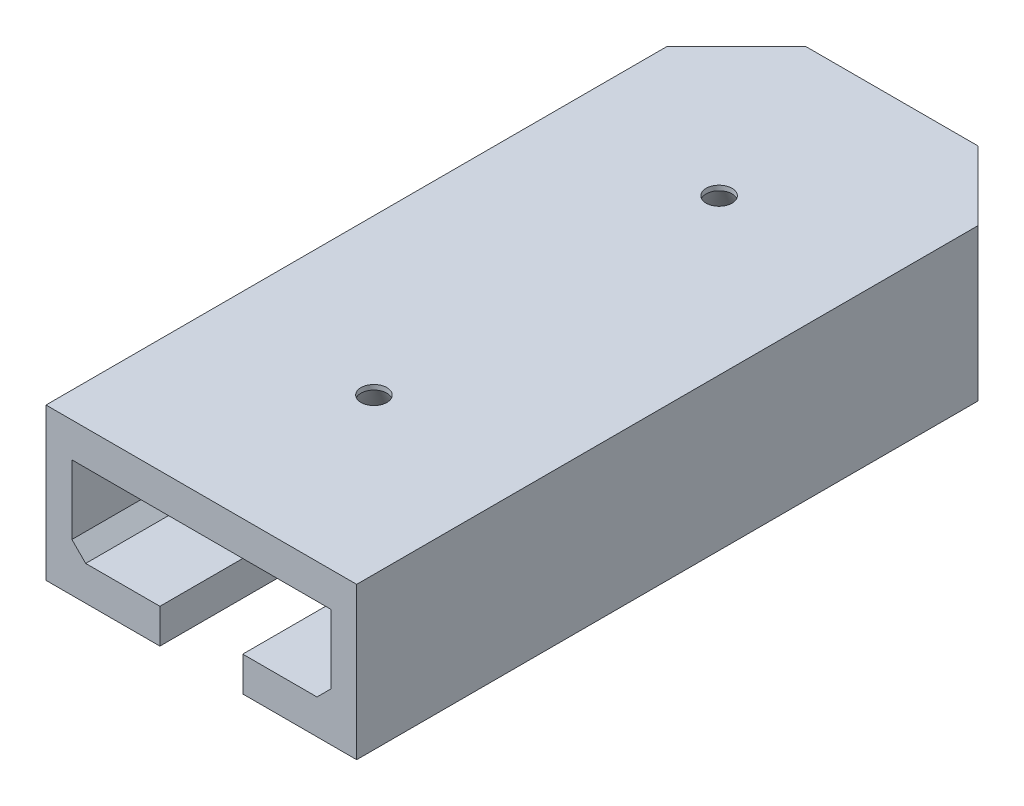
ISO-10303-21;
HEADER;
FILE_DESCRIPTION(('STEP AP214'),'2;1');
FILE_NAME('part.step','',(''),(''),'','','');
FILE_SCHEMA(('AUTOMOTIVE_DESIGN { 1 0 10303 214 1 1 1 1 }'));
ENDSEC;
DATA;
#1=APPLICATION_CONTEXT('core data for automotive mechanical design processes');
#2=APPLICATION_PROTOCOL_DEFINITION('international standard','automotive_design',2000,#1);
#3=PRODUCT_CONTEXT('',#1,'mechanical');
#4=PRODUCT('Part','Part','',(#3));
#5=PRODUCT_RELATED_PRODUCT_CATEGORY('part','',(#4));
#6=PRODUCT_DEFINITION_FORMATION('','',#4);
#7=PRODUCT_DEFINITION_CONTEXT('part definition',#1,'design');
#8=PRODUCT_DEFINITION('design','',#6,#7);
#9=PRODUCT_DEFINITION_SHAPE('','',#8);
#10=(LENGTH_UNIT() NAMED_UNIT(*) SI_UNIT(.MILLI.,.METRE.));
#11=(NAMED_UNIT(*) PLANE_ANGLE_UNIT() SI_UNIT($,.RADIAN.));
#12=(NAMED_UNIT(*) SI_UNIT($,.STERADIAN.) SOLID_ANGLE_UNIT());
#13=UNCERTAINTY_MEASURE_WITH_UNIT(LENGTH_MEASURE(1.E-05),#10,'distance_accuracy_value','');
#14=(GEOMETRIC_REPRESENTATION_CONTEXT(3) GLOBAL_UNCERTAINTY_ASSIGNED_CONTEXT((#13)) GLOBAL_UNIT_ASSIGNED_CONTEXT((#10,
#11,#12)) REPRESENTATION_CONTEXT('',''));
#15=CARTESIAN_POINT('',(0.,0.,0.));
#16=DIRECTION('',(0.,0.,1.));
#17=DIRECTION('',(1.,0.,0.));
#18=AXIS2_PLACEMENT_3D('',#15,#16,#17);
#19=CARTESIAN_POINT('',(0.,0.,0.));
#20=DIRECTION('',(0.,1.,0.));
#21=DIRECTION('',(0.,0.,1.));
#22=AXIS2_PLACEMENT_3D('',#19,#20,#21);
#23=PLANE('',#22);
#24=CARTESIAN_POINT('',(0.,0.,-25.));
#25=DIRECTION('',(0.,-1.,0.));
#26=DIRECTION('',(0.,0.,-1.));
#27=AXIS2_PLACEMENT_3D('',#24,#25,#26);
#28=CIRCLE('',#27,4.5);
#29=CARTESIAN_POINT('',(0.,0.,-29.5));
#30=VERTEX_POINT('',#29);
#31=EDGE_CURVE('E231',#30,#30,#28,.T.);
#32=ORIENTED_EDGE('',*,*,#31,.F.);
#33=EDGE_LOOP('',(#32));
#34=FACE_BOUND('',#33,.T.);
#35=CARTESIAN_POINT('',(0.,0.,25.));
#36=DIRECTION('',(0.,1.,0.));
#37=DIRECTION('',(0.,0.,1.));
#38=AXIS2_PLACEMENT_3D('',#35,#36,#37);
#39=CIRCLE('',#38,4.5);
#40=CARTESIAN_POINT('',(0.,0.,29.5));
#41=VERTEX_POINT('',#40);
#42=EDGE_CURVE('E237',#41,#41,#39,.T.);
#43=ORIENTED_EDGE('',*,*,#42,.T.);
#44=EDGE_LOOP('',(#43));
#45=FACE_BOUND('',#44,.T.);
#46=DIRECTION('',(0.,0.,1.));
#47=VECTOR('',#46,1.);
#48=CARTESIAN_POINT('',(-18.75,0.,50.));
#49=LINE('',#48,#47);
#50=CARTESIAN_POINT('',(-18.75,0.,-40.));
#51=VERTEX_POINT('',#50);
#52=CARTESIAN_POINT('',(-18.75,0.,50.));
#53=VERTEX_POINT('',#52);
#54=EDGE_CURVE('E255',#51,#53,#49,.T.);
#55=ORIENTED_EDGE('',*,*,#54,.F.);
#56=DIRECTION('',(-0.707106781186548,0.,0.707106781186547));
#57=VECTOR('',#56,1.);
#58=CARTESIAN_POINT('',(-18.75,0.,-40.));
#59=LINE('',#58,#57);
#60=CARTESIAN_POINT('',(-12.5,0.,-46.25));
#61=VERTEX_POINT('',#60);
#62=EDGE_CURVE('E252',#61,#51,#59,.T.);
#63=ORIENTED_EDGE('',*,*,#62,.F.);
#64=DIRECTION('',(-1.,0.,0.));
#65=VECTOR('',#64,1.);
#66=CARTESIAN_POINT('',(-12.5,0.,-46.25));
#67=LINE('',#66,#65);
#68=CARTESIAN_POINT('',(12.5,0.,-46.25));
#69=VERTEX_POINT('',#68);
#70=EDGE_CURVE('E249',#69,#61,#67,.T.);
#71=ORIENTED_EDGE('',*,*,#70,.F.);
#72=DIRECTION('',(-0.707106781186548,0.,-0.707106781186547));
#73=VECTOR('',#72,1.);
#74=CARTESIAN_POINT('',(12.5,0.,-46.25));
#75=LINE('',#74,#73);
#76=CARTESIAN_POINT('',(18.75,0.,-40.));
#77=VERTEX_POINT('',#76);
#78=EDGE_CURVE('E246',#77,#69,#75,.T.);
#79=ORIENTED_EDGE('',*,*,#78,.F.);
#80=DIRECTION('',(0.,0.,-1.));
#81=VECTOR('',#80,1.);
#82=CARTESIAN_POINT('',(18.75,0.,-40.));
#83=LINE('',#82,#81);
#84=CARTESIAN_POINT('',(18.75,0.,50.));
#85=VERTEX_POINT('',#84);
#86=EDGE_CURVE('E243',#85,#77,#83,.T.);
#87=ORIENTED_EDGE('',*,*,#86,.F.);
#88=DIRECTION('',(1.,0.,0.));
#89=VECTOR('',#88,1.);
#90=CARTESIAN_POINT('',(-22.5,0.,50.));
#91=LINE('',#90,#89);
#92=EDGE_CURVE('E276',#53,#85,#91,.T.);
#93=ORIENTED_EDGE('',*,*,#92,.F.);
#94=EDGE_LOOP('',(#55,#63,#71,#79,#87,#93));
#95=FACE_BOUND('',#94,.T.);
#96=ADVANCED_FACE('F33',(#34,#45,#95),#23,.F.);
#97=CARTESIAN_POINT('',(0.,5.,0.));
#98=DIRECTION('',(0.,1.,0.));
#99=DIRECTION('',(0.,0.,1.));
#100=AXIS2_PLACEMENT_3D('',#97,#98,#99);
#101=PLANE('',#100);
#102=CARTESIAN_POINT('',(0.,5.,-25.));
#103=DIRECTION('',(0.,1.,0.));
#104=DIRECTION('',(0.,0.,1.));
#105=AXIS2_PLACEMENT_3D('',#102,#103,#104);
#106=CIRCLE('',#105,1.875);
#107=CARTESIAN_POINT('',(0.,5.,-23.125));
#108=VERTEX_POINT('',#107);
#109=EDGE_CURVE('E273',#108,#108,#106,.T.);
#110=ORIENTED_EDGE('',*,*,#109,.F.);
#111=EDGE_LOOP('',(#110));
#112=FACE_BOUND('',#111,.T.);
#113=DIRECTION('',(0.,0.,-1.));
#114=VECTOR('',#113,1.);
#115=CARTESIAN_POINT('',(22.5,5.,-40.));
#116=LINE('',#115,#114);
#117=CARTESIAN_POINT('',(22.5,5.,50.));
#118=VERTEX_POINT('',#117);
#119=CARTESIAN_POINT('',(22.5,5.,-40.));
#120=VERTEX_POINT('',#119);
#121=EDGE_CURVE('E277',#118,#120,#116,.T.);
#122=ORIENTED_EDGE('',*,*,#121,.T.);
#123=DIRECTION('',(-0.707106781186547,0.,-0.707106781186548));
#124=VECTOR('',#123,1.);
#125=CARTESIAN_POINT('',(12.5,5.,-50.));
#126=LINE('',#125,#124);
#127=CARTESIAN_POINT('',(12.5,5.,-50.));
#128=VERTEX_POINT('',#127);
#129=EDGE_CURVE('E280',#120,#128,#126,.T.);
#130=ORIENTED_EDGE('',*,*,#129,.T.);
#131=DIRECTION('',(-1.,0.,0.));
#132=VECTOR('',#131,1.);
#133=CARTESIAN_POINT('',(-12.5,5.,-50.));
#134=LINE('',#133,#132);
#135=CARTESIAN_POINT('',(-12.5,5.,-50.));
#136=VERTEX_POINT('',#135);
#137=EDGE_CURVE('E282',#128,#136,#134,.T.);
#138=ORIENTED_EDGE('',*,*,#137,.T.);
#139=DIRECTION('',(-0.707106781186547,0.,0.707106781186548));
#140=VECTOR('',#139,1.);
#141=CARTESIAN_POINT('',(-22.5,5.,-40.));
#142=LINE('',#141,#140);
#143=CARTESIAN_POINT('',(-22.5,5.,-40.));
#144=VERTEX_POINT('',#143);
#145=EDGE_CURVE('E284',#136,#144,#142,.T.);
#146=ORIENTED_EDGE('',*,*,#145,.T.);
#147=DIRECTION('',(0.,0.,1.));
#148=VECTOR('',#147,1.);
#149=CARTESIAN_POINT('',(-22.5,5.,-40.));
#150=LINE('',#149,#148);
#151=CARTESIAN_POINT('',(-22.5,5.,50.));
#152=VERTEX_POINT('',#151);
#153=EDGE_CURVE('E172',#144,#152,#150,.T.);
#154=ORIENTED_EDGE('',*,*,#153,.T.);
#155=DIRECTION('',(1.,0.,0.));
#156=VECTOR('',#155,1.);
#157=CARTESIAN_POINT('',(-22.5,5.,50.));
#158=LINE('',#157,#156);
#159=EDGE_CURVE('E287',#152,#118,#158,.T.);
#160=ORIENTED_EDGE('',*,*,#159,.T.);
#161=EDGE_LOOP('',(#122,#130,#138,#146,#154,#160));
#162=FACE_BOUND('',#161,.T.);
#163=CARTESIAN_POINT('',(0.,5.,25.));
#164=DIRECTION('',(0.,1.,0.));
#165=DIRECTION('',(0.,0.,1.));
#166=AXIS2_PLACEMENT_3D('',#163,#164,#165);
#167=CIRCLE('',#166,1.875);
#168=CARTESIAN_POINT('',(0.,5.,26.875));
#169=VERTEX_POINT('',#168);
#170=EDGE_CURVE('E270',#169,#169,#167,.T.);
#171=ORIENTED_EDGE('',*,*,#170,.F.);
#172=EDGE_LOOP('',(#171));
#173=FACE_BOUND('',#172,.T.);
#174=ADVANCED_FACE('F402',(#112,#162,#173),#101,.T.);
#175=CARTESIAN_POINT('',(22.5,5.,-40.));
#176=DIRECTION('',(-1.,0.,0.));
#177=DIRECTION('',(0.,0.,1.));
#178=AXIS2_PLACEMENT_3D('',#175,#176,#177);
#179=PLANE('',#178);
#180=DIRECTION('',(0.,-1.,0.));
#181=VECTOR('',#180,1.);
#182=CARTESIAN_POINT('',(22.5,5.,50.));
#183=LINE('',#182,#181);
#184=CARTESIAN_POINT('',(22.5,-17.,50.));
#185=VERTEX_POINT('',#184);
#186=EDGE_CURVE('E289',#118,#185,#183,.T.);
#187=ORIENTED_EDGE('',*,*,#186,.T.);
#188=DIRECTION('',(0.,0.,1.));
#189=VECTOR('',#188,1.);
#190=CARTESIAN_POINT('',(22.5,-17.,-40.));
#191=LINE('',#190,#189);
#192=CARTESIAN_POINT('',(22.5,-17.,-40.));
#193=VERTEX_POINT('',#192);
#194=EDGE_CURVE('E200',#193,#185,#191,.T.);
#195=ORIENTED_EDGE('',*,*,#194,.F.);
#196=DIRECTION('',(0.,-1.,0.));
#197=VECTOR('',#196,1.);
#198=CARTESIAN_POINT('',(22.5,5.,-40.));
#199=LINE('',#198,#197);
#200=EDGE_CURVE('E297',#120,#193,#199,.T.);
#201=ORIENTED_EDGE('',*,*,#200,.F.);
#202=ORIENTED_EDGE('',*,*,#121,.F.);
#203=EDGE_LOOP('',(#187,#195,#201,#202));
#204=FACE_BOUND('',#203,.T.);
#205=ADVANCED_FACE('F408',(#204),#179,.F.);
#206=CARTESIAN_POINT('',(12.5,5.,-50.));
#207=DIRECTION('',(-0.707106781186548,0.,0.707106781186547));
#208=DIRECTION('',(0.707106781186547,0.,0.707106781186548));
#209=AXIS2_PLACEMENT_3D('',#206,#207,#208);
#210=PLANE('',#209);
#211=ORIENTED_EDGE('',*,*,#200,.T.);
#212=DIRECTION('',(0.707106781186547,0.,0.707106781186548));
#213=VECTOR('',#212,1.);
#214=CARTESIAN_POINT('',(12.5,-17.,-50.));
#215=LINE('',#214,#213);
#216=CARTESIAN_POINT('',(12.5,-17.,-50.));
#217=VERTEX_POINT('',#216);
#218=EDGE_CURVE('E197',#217,#193,#215,.T.);
#219=ORIENTED_EDGE('',*,*,#218,.F.);
#220=DIRECTION('',(0.,-1.,0.));
#221=VECTOR('',#220,1.);
#222=CARTESIAN_POINT('',(12.5,5.,-50.));
#223=LINE('',#222,#221);
#224=EDGE_CURVE('E295',#128,#217,#223,.T.);
#225=ORIENTED_EDGE('',*,*,#224,.F.);
#226=ORIENTED_EDGE('',*,*,#129,.F.);
#227=EDGE_LOOP('',(#211,#219,#225,#226));
#228=FACE_BOUND('',#227,.T.);
#229=ADVANCED_FACE('F425',(#228),#210,.F.);
#230=CARTESIAN_POINT('',(-12.5,5.,-50.));
#231=DIRECTION('',(0.,0.,1.));
#232=DIRECTION('',(1.,0.,0.));
#233=AXIS2_PLACEMENT_3D('',#230,#231,#232);
#234=PLANE('',#233);
#235=ORIENTED_EDGE('',*,*,#224,.T.);
#236=DIRECTION('',(1.,0.,0.));
#237=VECTOR('',#236,1.);
#238=CARTESIAN_POINT('',(-12.5,-17.,-50.));
#239=LINE('',#238,#237);
#240=CARTESIAN_POINT('',(-12.5,-17.,-50.));
#241=VERTEX_POINT('',#240);
#242=EDGE_CURVE('E185',#241,#217,#239,.T.);
#243=ORIENTED_EDGE('',*,*,#242,.F.);
#244=DIRECTION('',(0.,-1.,0.));
#245=VECTOR('',#244,1.);
#246=CARTESIAN_POINT('',(-12.5,5.,-50.));
#247=LINE('',#246,#245);
#248=EDGE_CURVE('E175',#136,#241,#247,.T.);
#249=ORIENTED_EDGE('',*,*,#248,.F.);
#250=ORIENTED_EDGE('',*,*,#137,.F.);
#251=EDGE_LOOP('',(#235,#243,#249,#250));
#252=FACE_BOUND('',#251,.T.);
#253=ADVANCED_FACE('F422',(#252),#234,.F.);
#254=CARTESIAN_POINT('',(-22.5,5.,-40.));
#255=DIRECTION('',(0.707106781186548,0.,0.707106781186547));
#256=DIRECTION('',(0.707106781186547,0.,-0.707106781186548));
#257=AXIS2_PLACEMENT_3D('',#254,#255,#256);
#258=PLANE('',#257);
#259=ORIENTED_EDGE('',*,*,#248,.T.);
#260=DIRECTION('',(0.707106781186547,0.,-0.707106781186548));
#261=VECTOR('',#260,1.);
#262=CARTESIAN_POINT('',(-22.5,-17.,-40.));
#263=LINE('',#262,#261);
#264=CARTESIAN_POINT('',(-22.5,-17.,-40.));
#265=VERTEX_POINT('',#264);
#266=EDGE_CURVE('E179',#265,#241,#263,.T.);
#267=ORIENTED_EDGE('',*,*,#266,.F.);
#268=DIRECTION('',(0.,-1.,0.));
#269=VECTOR('',#268,1.);
#270=CARTESIAN_POINT('',(-22.5,5.,-40.));
#271=LINE('',#270,#269);
#272=EDGE_CURVE('E166',#144,#265,#271,.T.);
#273=ORIENTED_EDGE('',*,*,#272,.F.);
#274=ORIENTED_EDGE('',*,*,#145,.F.);
#275=EDGE_LOOP('',(#259,#267,#273,#274));
#276=FACE_BOUND('',#275,.T.);
#277=ADVANCED_FACE('F180',(#276),#258,.F.);
#278=CARTESIAN_POINT('',(-22.5,5.,-40.));
#279=DIRECTION('',(1.,0.,0.));
#280=DIRECTION('',(0.,0.,-1.));
#281=AXIS2_PLACEMENT_3D('',#278,#279,#280);
#282=PLANE('',#281);
#283=ORIENTED_EDGE('',*,*,#272,.T.);
#284=DIRECTION('',(0.,0.,-1.));
#285=VECTOR('',#284,1.);
#286=CARTESIAN_POINT('',(-22.5,-17.,50.));
#287=LINE('',#286,#285);
#288=CARTESIAN_POINT('',(-22.5,-17.,50.));
#289=VERTEX_POINT('',#288);
#290=EDGE_CURVE('E171',#289,#265,#287,.T.);
#291=ORIENTED_EDGE('',*,*,#290,.F.);
#292=DIRECTION('',(0.,-1.,0.));
#293=VECTOR('',#292,1.);
#294=CARTESIAN_POINT('',(-22.5,5.,50.));
#295=LINE('',#294,#293);
#296=EDGE_CURVE('E176',#152,#289,#295,.T.);
#297=ORIENTED_EDGE('',*,*,#296,.F.);
#298=ORIENTED_EDGE('',*,*,#153,.F.);
#299=EDGE_LOOP('',(#283,#291,#297,#298));
#300=FACE_BOUND('',#299,.T.);
#301=ADVANCED_FACE('F168',(#300),#282,.F.);
#302=CARTESIAN_POINT('',(-22.5,5.,50.));
#303=DIRECTION('',(0.,0.,-1.));
#304=DIRECTION('',(-1.,0.,0.));
#305=AXIS2_PLACEMENT_3D('',#302,#303,#304);
#306=PLANE('',#305);
#307=ORIENTED_EDGE('',*,*,#296,.T.);
#308=DIRECTION('',(-1.,0.,0.));
#309=VECTOR('',#308,1.);
#310=CARTESIAN_POINT('',(-22.5,-17.,50.));
#311=LINE('',#310,#309);
#312=CARTESIAN_POINT('',(-6.00000000000001,-17.,50.));
#313=VERTEX_POINT('',#312);
#314=EDGE_CURVE('E190',#313,#289,#311,.T.);
#315=ORIENTED_EDGE('',*,*,#314,.F.);
#316=DIRECTION('',(0.,1.,0.));
#317=VECTOR('',#316,1.);
#318=CARTESIAN_POINT('',(-6.00000000000001,-17.,50.));
#319=LINE('',#318,#317);
#320=CARTESIAN_POINT('',(-6.00000000000001,-12.,50.));
#321=VERTEX_POINT('',#320);
#322=EDGE_CURVE('E212',#313,#321,#319,.T.);
#323=ORIENTED_EDGE('',*,*,#322,.T.);
#324=DIRECTION('',(-1.,0.,0.));
#325=VECTOR('',#324,1.);
#326=CARTESIAN_POINT('',(-22.5,-12.,50.));
#327=LINE('',#326,#325);
#328=CARTESIAN_POINT('',(-16.75,-12.,50.));
#329=VERTEX_POINT('',#328);
#330=EDGE_CURVE('E191',#321,#329,#327,.T.);
#331=ORIENTED_EDGE('',*,*,#330,.T.);
#332=DIRECTION('',(0.70710678118655,-0.707106781186545,0.));
#333=VECTOR('',#332,1.);
#334=CARTESIAN_POINT('',(-28.125,-0.62500000000006,50.));
#335=LINE('',#334,#333);
#336=CARTESIAN_POINT('',(-18.75,-10.,50.));
#337=VERTEX_POINT('',#336);
#338=EDGE_CURVE('E11',#329,#337,#335,.F.);
#339=ORIENTED_EDGE('',*,*,#338,.T.);
#340=DIRECTION('',(0.,1.,0.));
#341=VECTOR('',#340,1.);
#342=CARTESIAN_POINT('',(-18.75,-12.,50.));
#343=LINE('',#342,#341);
#344=EDGE_CURVE('E258',#337,#53,#343,.T.);
#345=ORIENTED_EDGE('',*,*,#344,.T.);
#346=ORIENTED_EDGE('',*,*,#92,.T.);
#347=DIRECTION('',(0.,1.,0.));
#348=VECTOR('',#347,1.);
#349=CARTESIAN_POINT('',(18.75,-12.,50.));
#350=LINE('',#349,#348);
#351=CARTESIAN_POINT('',(18.75,-10.,50.));
#352=VERTEX_POINT('',#351);
#353=EDGE_CURVE('E268',#352,#85,#350,.T.);
#354=ORIENTED_EDGE('',*,*,#353,.F.);
#355=DIRECTION('',(0.70710678118655,0.707106781186545,0.));
#356=VECTOR('',#355,1.);
#357=CARTESIAN_POINT('',(5.62499999999986,-23.1250000000001,50.));
#358=LINE('',#357,#356);
#359=CARTESIAN_POINT('',(16.75,-12.,50.));
#360=VERTEX_POINT('',#359);
#361=EDGE_CURVE('E42',#352,#360,#358,.F.);
#362=ORIENTED_EDGE('',*,*,#361,.T.);
#363=DIRECTION('',(-1.,0.,0.));
#364=VECTOR('',#363,1.);
#365=CARTESIAN_POINT('',(22.5,-12.,50.));
#366=LINE('',#365,#364);
#367=CARTESIAN_POINT('',(6.,-12.,50.));
#368=VERTEX_POINT('',#367);
#369=EDGE_CURVE('E213',#360,#368,#366,.T.);
#370=ORIENTED_EDGE('',*,*,#369,.T.);
#371=DIRECTION('',(0.,1.,0.));
#372=VECTOR('',#371,1.);
#373=CARTESIAN_POINT('',(6.,-17.,50.));
#374=LINE('',#373,#372);
#375=CARTESIAN_POINT('',(6.,-17.,50.));
#376=VERTEX_POINT('',#375);
#377=EDGE_CURVE('E228',#376,#368,#374,.T.);
#378=ORIENTED_EDGE('',*,*,#377,.F.);
#379=DIRECTION('',(-1.,0.,0.));
#380=VECTOR('',#379,1.);
#381=CARTESIAN_POINT('',(22.5,-17.,50.));
#382=LINE('',#381,#380);
#383=EDGE_CURVE('E203',#185,#376,#382,.T.);
#384=ORIENTED_EDGE('',*,*,#383,.F.);
#385=ORIENTED_EDGE('',*,*,#186,.F.);
#386=ORIENTED_EDGE('',*,*,#159,.F.);
#387=EDGE_LOOP('',(#307,#315,#323,#331,#339,#345,#346,#354,#362,#370,#378,#384,#385,#386));
#388=FACE_BOUND('',#387,.T.);
#389=ADVANCED_FACE('F343',(#388),#306,.F.);
#390=CARTESIAN_POINT('',(0.,5.,-25.));
#391=DIRECTION('',(0.,-1.,0.));
#392=DIRECTION('',(0.,0.,-1.));
#393=AXIS2_PLACEMENT_3D('',#390,#391,#392);
#394=CYLINDRICAL_SURFACE('',#393,1.875);
#395=CARTESIAN_POINT('',(0.,4.3,-25.));
#396=DIRECTION('',(0.,-1.,0.));
#397=DIRECTION('',(0.,0.,-1.));
#398=AXIS2_PLACEMENT_3D('',#395,#396,#397);
#399=CIRCLE('',#398,1.875);
#400=CARTESIAN_POINT('',(0.,4.3,-26.875));
#401=VERTEX_POINT('',#400);
#402=EDGE_CURVE('E234',#401,#401,#399,.T.);
#403=ORIENTED_EDGE('',*,*,#402,.T.);
#404=EDGE_LOOP('',(#403));
#405=FACE_BOUND('',#404,.T.);
#406=ORIENTED_EDGE('',*,*,#109,.T.);
#407=EDGE_LOOP('',(#406));
#408=FACE_BOUND('',#407,.T.);
#409=ADVANCED_FACE('F417',(#405,#408),#394,.F.);
#410=CARTESIAN_POINT('',(0.,5.,25.));
#411=DIRECTION('',(0.,-1.,0.));
#412=DIRECTION('',(0.,0.,-1.));
#413=AXIS2_PLACEMENT_3D('',#410,#411,#412);
#414=CYLINDRICAL_SURFACE('',#413,1.875);
#415=CARTESIAN_POINT('',(0.,4.3,25.));
#416=DIRECTION('',(0.,1.,0.));
#417=DIRECTION('',(0.,0.,1.));
#418=AXIS2_PLACEMENT_3D('',#415,#416,#417);
#419=CIRCLE('',#418,1.875);
#420=CARTESIAN_POINT('',(0.,4.3,26.875));
#421=VERTEX_POINT('',#420);
#422=EDGE_CURVE('E240',#421,#421,#419,.T.);
#423=ORIENTED_EDGE('',*,*,#422,.F.);
#424=EDGE_LOOP('',(#423));
#425=FACE_BOUND('',#424,.T.);
#426=ORIENTED_EDGE('',*,*,#170,.T.);
#427=EDGE_LOOP('',(#426));
#428=FACE_BOUND('',#427,.T.);
#429=ADVANCED_FACE('F541',(#425,#428),#414,.F.);
#430=CARTESIAN_POINT('',(18.75,-12.,-40.));
#431=DIRECTION('',(1.,0.,0.));
#432=DIRECTION('',(0.,0.,-1.));
#433=AXIS2_PLACEMENT_3D('',#430,#431,#432);
#434=PLANE('',#433);
#435=DIRECTION('',(0.,1.,0.));
#436=VECTOR('',#435,1.);
#437=CARTESIAN_POINT('',(18.75,-12.,-40.));
#438=LINE('',#437,#436);
#439=CARTESIAN_POINT('',(18.75,-10.,-40.));
#440=VERTEX_POINT('',#439);
#441=EDGE_CURVE('E266',#440,#77,#438,.T.);
#442=ORIENTED_EDGE('',*,*,#441,.F.);
#443=DIRECTION('',(0.,0.,1.));
#444=VECTOR('',#443,1.);
#445=CARTESIAN_POINT('',(18.75,-10.,50.));
#446=LINE('',#445,#444);
#447=EDGE_CURVE('E310',#440,#352,#446,.T.);
#448=ORIENTED_EDGE('',*,*,#447,.T.);
#449=ORIENTED_EDGE('',*,*,#353,.T.);
#450=ORIENTED_EDGE('',*,*,#86,.T.);
#451=EDGE_LOOP('',(#442,#448,#449,#450));
#452=FACE_BOUND('',#451,.T.);
#453=ADVANCED_FACE('F380',(#452),#434,.F.);
#454=CARTESIAN_POINT('',(12.5,-12.,-46.25));
#455=DIRECTION('',(0.707106781186547,0.,-0.707106781186548));
#456=DIRECTION('',(-0.707106781186548,0.,-0.707106781186547));
#457=AXIS2_PLACEMENT_3D('',#454,#455,#456);
#458=PLANE('',#457);
#459=DIRECTION('',(0.,1.,0.));
#460=VECTOR('',#459,1.);
#461=CARTESIAN_POINT('',(12.5,-12.,-46.25));
#462=LINE('',#461,#460);
#463=CARTESIAN_POINT('',(12.5,-10.,-46.25));
#464=VERTEX_POINT('',#463);
#465=EDGE_CURVE('E264',#464,#69,#462,.T.);
#466=ORIENTED_EDGE('',*,*,#465,.F.);
#467=DIRECTION('',(0.707106781186548,0.,0.707106781186547));
#468=VECTOR('',#467,1.);
#469=CARTESIAN_POINT('',(18.75,-10.,-40.));
#470=LINE('',#469,#468);
#471=EDGE_CURVE('E312',#464,#440,#470,.T.);
#472=ORIENTED_EDGE('',*,*,#471,.T.);
#473=ORIENTED_EDGE('',*,*,#441,.T.);
#474=ORIENTED_EDGE('',*,*,#78,.T.);
#475=EDGE_LOOP('',(#466,#472,#473,#474));
#476=FACE_BOUND('',#475,.T.);
#477=ADVANCED_FACE('F377',(#476),#458,.F.);
#478=CARTESIAN_POINT('',(-12.5,-12.,-46.25));
#479=DIRECTION('',(0.,0.,-1.));
#480=DIRECTION('',(-1.,0.,0.));
#481=AXIS2_PLACEMENT_3D('',#478,#479,#480);
#482=PLANE('',#481);
#483=DIRECTION('',(0.,1.,0.));
#484=VECTOR('',#483,1.);
#485=CARTESIAN_POINT('',(-12.5,-12.,-46.25));
#486=LINE('',#485,#484);
#487=CARTESIAN_POINT('',(-12.5,-10.,-46.25));
#488=VERTEX_POINT('',#487);
#489=EDGE_CURVE('E262',#488,#61,#486,.T.);
#490=ORIENTED_EDGE('',*,*,#489,.F.);
#491=DIRECTION('',(1.,0.,0.));
#492=VECTOR('',#491,1.);
#493=CARTESIAN_POINT('',(12.5,-10.,-46.25));
#494=LINE('',#493,#492);
#495=EDGE_CURVE('E314',#488,#464,#494,.T.);
#496=ORIENTED_EDGE('',*,*,#495,.T.);
#497=ORIENTED_EDGE('',*,*,#465,.T.);
#498=ORIENTED_EDGE('',*,*,#70,.T.);
#499=EDGE_LOOP('',(#490,#496,#497,#498));
#500=FACE_BOUND('',#499,.T.);
#501=ADVANCED_FACE('F392',(#500),#482,.F.);
#502=CARTESIAN_POINT('',(-18.75,-12.,-40.));
#503=DIRECTION('',(-0.707106781186547,0.,-0.707106781186548));
#504=DIRECTION('',(-0.707106781186548,0.,0.707106781186547));
#505=AXIS2_PLACEMENT_3D('',#502,#503,#504);
#506=PLANE('',#505);
#507=DIRECTION('',(0.,1.,0.));
#508=VECTOR('',#507,1.);
#509=CARTESIAN_POINT('',(-18.75,-12.,-40.));
#510=LINE('',#509,#508);
#511=CARTESIAN_POINT('',(-18.75,-10.,-40.));
#512=VERTEX_POINT('',#511);
#513=EDGE_CURVE('E260',#512,#51,#510,.T.);
#514=ORIENTED_EDGE('',*,*,#513,.F.);
#515=DIRECTION('',(0.707106781186548,0.,-0.707106781186547));
#516=VECTOR('',#515,1.);
#517=CARTESIAN_POINT('',(-12.5,-10.,-46.25));
#518=LINE('',#517,#516);
#519=EDGE_CURVE('E316',#512,#488,#518,.T.);
#520=ORIENTED_EDGE('',*,*,#519,.T.);
#521=ORIENTED_EDGE('',*,*,#489,.T.);
#522=ORIENTED_EDGE('',*,*,#62,.T.);
#523=EDGE_LOOP('',(#514,#520,#521,#522));
#524=FACE_BOUND('',#523,.T.);
#525=ADVANCED_FACE('F389',(#524),#506,.F.);
#526=CARTESIAN_POINT('',(-18.75,-12.,50.));
#527=DIRECTION('',(-1.,0.,0.));
#528=DIRECTION('',(0.,0.,1.));
#529=AXIS2_PLACEMENT_3D('',#526,#527,#528);
#530=PLANE('',#529);
#531=ORIENTED_EDGE('',*,*,#344,.F.);
#532=DIRECTION('',(0.,0.,-1.));
#533=VECTOR('',#532,1.);
#534=CARTESIAN_POINT('',(-18.75,-10.,-40.));
#535=LINE('',#534,#533);
#536=EDGE_CURVE('E55',#337,#512,#535,.T.);
#537=ORIENTED_EDGE('',*,*,#536,.T.);
#538=ORIENTED_EDGE('',*,*,#513,.T.);
#539=ORIENTED_EDGE('',*,*,#54,.T.);
#540=EDGE_LOOP('',(#531,#537,#538,#539));
#541=FACE_BOUND('',#540,.T.);
#542=ADVANCED_FACE('F386',(#541),#530,.F.);
#543=CARTESIAN_POINT('',(0.,4.3,25.));
#544=DIRECTION('',(0.,-1.,0.));
#545=DIRECTION('',(0.,0.,-1.));
#546=AXIS2_PLACEMENT_3D('',#543,#544,#545);
#547=CONICAL_SURFACE('',#546,1.875,0.548078924950543);
#548=ORIENTED_EDGE('',*,*,#42,.F.);
#549=EDGE_LOOP('',(#548));
#550=FACE_BOUND('',#549,.T.);
#551=ORIENTED_EDGE('',*,*,#422,.T.);
#552=EDGE_LOOP('',(#551));
#553=FACE_BOUND('',#552,.T.);
#554=ADVANCED_FACE('F460',(#550,#553),#547,.F.);
#555=CARTESIAN_POINT('',(0.,4.3,-25.));
#556=DIRECTION('',(0.,-1.,0.));
#557=DIRECTION('',(0.,0.,1.));
#558=AXIS2_PLACEMENT_3D('',#555,#556,#557);
#559=CONICAL_SURFACE('',#558,1.875,0.548078924950543);
#560=ORIENTED_EDGE('',*,*,#31,.T.);
#561=EDGE_LOOP('',(#560));
#562=FACE_BOUND('',#561,.T.);
#563=ORIENTED_EDGE('',*,*,#402,.F.);
#564=EDGE_LOOP('',(#563));
#565=FACE_BOUND('',#564,.T.);
#566=ADVANCED_FACE('F452',(#562,#565),#559,.F.);
#567=CARTESIAN_POINT('',(0.,-12.,0.));
#568=DIRECTION('',(0.,-1.,0.));
#569=DIRECTION('',(0.,0.,-1.));
#570=AXIS2_PLACEMENT_3D('',#567,#568,#569);
#571=PLANE('',#570);
#572=ORIENTED_EDGE('',*,*,#369,.F.);
#573=DIRECTION('',(0.,0.,-1.));
#574=VECTOR('',#573,1.);
#575=CARTESIAN_POINT('',(16.75,-12.,-40.));
#576=LINE('',#575,#574);
#577=CARTESIAN_POINT('',(16.75,-12.,-39.1715728752538));
#578=VERTEX_POINT('',#577);
#579=EDGE_CURVE('E307',#360,#578,#576,.T.);
#580=ORIENTED_EDGE('',*,*,#579,.T.);
#581=DIRECTION('',(-0.707106781186548,0.,-0.707106781186547));
#582=VECTOR('',#581,1.);
#583=CARTESIAN_POINT('',(11.0857864376269,-12.,-44.8357864376269));
#584=LINE('',#583,#582);
#585=CARTESIAN_POINT('',(11.6715728752538,-12.,-44.25));
#586=VERTEX_POINT('',#585);
#587=EDGE_CURVE('E305',#578,#586,#584,.T.);
#588=ORIENTED_EDGE('',*,*,#587,.T.);
#589=DIRECTION('',(-1.,0.,0.));
#590=VECTOR('',#589,1.);
#591=CARTESIAN_POINT('',(-12.5,-12.,-44.25));
#592=LINE('',#591,#590);
#593=CARTESIAN_POINT('',(-11.6715728752538,-12.,-44.25));
#594=VERTEX_POINT('',#593);
#595=EDGE_CURVE('E303',#586,#594,#592,.T.);
#596=ORIENTED_EDGE('',*,*,#595,.T.);
#597=DIRECTION('',(-0.707106781186548,0.,0.707106781186547));
#598=VECTOR('',#597,1.);
#599=CARTESIAN_POINT('',(-17.3357864376269,-12.,-38.5857864376269));
#600=LINE('',#599,#598);
#601=CARTESIAN_POINT('',(-16.75,-12.,-39.1715728752538));
#602=VERTEX_POINT('',#601);
#603=EDGE_CURVE('E301',#594,#602,#600,.T.);
#604=ORIENTED_EDGE('',*,*,#603,.T.);
#605=DIRECTION('',(0.,0.,1.));
#606=VECTOR('',#605,1.);
#607=CARTESIAN_POINT('',(-16.75,-12.,50.));
#608=LINE('',#607,#606);
#609=EDGE_CURVE('E299',#602,#329,#608,.T.);
#610=ORIENTED_EDGE('',*,*,#609,.T.);
#611=ORIENTED_EDGE('',*,*,#330,.F.);
#612=DIRECTION('',(0.,0.,1.));
#613=VECTOR('',#612,1.);
#614=CARTESIAN_POINT('',(-6.00000000000001,-12.,50.));
#615=LINE('',#614,#613);
#616=CARTESIAN_POINT('',(-6.,-12.,-41.25));
#617=VERTEX_POINT('',#616);
#618=EDGE_CURVE('E193',#617,#321,#615,.T.);
#619=ORIENTED_EDGE('',*,*,#618,.F.);
#620=DIRECTION('',(-1.,0.,0.));
#621=VECTOR('',#620,1.);
#622=CARTESIAN_POINT('',(6.00000000000001,-12.,-41.25));
#623=LINE('',#622,#621);
#624=CARTESIAN_POINT('',(6.00000000000001,-12.,-41.25));
#625=VERTEX_POINT('',#624);
#626=EDGE_CURVE('E217',#625,#617,#623,.T.);
#627=ORIENTED_EDGE('',*,*,#626,.F.);
#628=DIRECTION('',(0.,0.,-1.));
#629=VECTOR('',#628,1.);
#630=CARTESIAN_POINT('',(6.,-12.,50.));
#631=LINE('',#630,#629);
#632=EDGE_CURVE('E215',#368,#625,#631,.T.);
#633=ORIENTED_EDGE('',*,*,#632,.F.);
#634=EDGE_LOOP('',(#572,#580,#588,#596,#604,#610,#611,#619,#627,#633));
#635=FACE_BOUND('',#634,.T.);
#636=ADVANCED_FACE('F341',(#635),#571,.F.);
#637=CARTESIAN_POINT('',(6.,-17.,50.));
#638=DIRECTION('',(1.,0.,0.));
#639=DIRECTION('',(0.,0.,-1.));
#640=AXIS2_PLACEMENT_3D('',#637,#638,#639);
#641=PLANE('',#640);
#642=ORIENTED_EDGE('',*,*,#632,.T.);
#643=DIRECTION('',(0.,1.,0.));
#644=VECTOR('',#643,1.);
#645=CARTESIAN_POINT('',(6.00000000000001,-17.,-41.25));
#646=LINE('',#645,#644);
#647=CARTESIAN_POINT('',(6.00000000000001,-17.,-41.25));
#648=VERTEX_POINT('',#647);
#649=EDGE_CURVE('E225',#648,#625,#646,.T.);
#650=ORIENTED_EDGE('',*,*,#649,.F.);
#651=DIRECTION('',(0.,0.,-1.));
#652=VECTOR('',#651,1.);
#653=CARTESIAN_POINT('',(6.,-17.,50.));
#654=LINE('',#653,#652);
#655=EDGE_CURVE('E205',#376,#648,#654,.T.);
#656=ORIENTED_EDGE('',*,*,#655,.F.);
#657=ORIENTED_EDGE('',*,*,#377,.T.);
#658=EDGE_LOOP('',(#642,#650,#656,#657));
#659=FACE_BOUND('',#658,.T.);
#660=ADVANCED_FACE('F357',(#659),#641,.F.);
#661=CARTESIAN_POINT('',(6.00000000000001,-17.,-41.25));
#662=DIRECTION('',(0.,0.,-1.));
#663=DIRECTION('',(-1.,0.,0.));
#664=AXIS2_PLACEMENT_3D('',#661,#662,#663);
#665=PLANE('',#664);
#666=ORIENTED_EDGE('',*,*,#626,.T.);
#667=DIRECTION('',(0.,1.,0.));
#668=VECTOR('',#667,1.);
#669=CARTESIAN_POINT('',(-6.,-17.,-41.25));
#670=LINE('',#669,#668);
#671=CARTESIAN_POINT('',(-6.,-17.,-41.25));
#672=VERTEX_POINT('',#671);
#673=EDGE_CURVE('E222',#672,#617,#670,.T.);
#674=ORIENTED_EDGE('',*,*,#673,.F.);
#675=DIRECTION('',(-1.,0.,0.));
#676=VECTOR('',#675,1.);
#677=CARTESIAN_POINT('',(6.00000000000001,-17.,-41.25));
#678=LINE('',#677,#676);
#679=EDGE_CURVE('E207',#648,#672,#678,.T.);
#680=ORIENTED_EDGE('',*,*,#679,.F.);
#681=ORIENTED_EDGE('',*,*,#649,.T.);
#682=EDGE_LOOP('',(#666,#674,#680,#681));
#683=FACE_BOUND('',#682,.T.);
#684=ADVANCED_FACE('F352',(#683),#665,.F.);
#685=CARTESIAN_POINT('',(-6.00000000000001,-17.,50.));
#686=DIRECTION('',(-1.,0.,0.));
#687=DIRECTION('',(0.,0.,1.));
#688=AXIS2_PLACEMENT_3D('',#685,#686,#687);
#689=PLANE('',#688);
#690=ORIENTED_EDGE('',*,*,#618,.T.);
#691=ORIENTED_EDGE('',*,*,#322,.F.);
#692=DIRECTION('',(0.,0.,1.));
#693=VECTOR('',#692,1.);
#694=CARTESIAN_POINT('',(-6.00000000000001,-17.,50.));
#695=LINE('',#694,#693);
#696=EDGE_CURVE('E209',#672,#313,#695,.T.);
#697=ORIENTED_EDGE('',*,*,#696,.F.);
#698=ORIENTED_EDGE('',*,*,#673,.T.);
#699=EDGE_LOOP('',(#690,#691,#697,#698));
#700=FACE_BOUND('',#699,.T.);
#701=ADVANCED_FACE('F347',(#700),#689,.F.);
#702=CARTESIAN_POINT('',(0.,-17.,0.));
#703=DIRECTION('',(0.,-1.,0.));
#704=DIRECTION('',(0.,0.,-1.));
#705=AXIS2_PLACEMENT_3D('',#702,#703,#704);
#706=PLANE('',#705);
#707=ORIENTED_EDGE('',*,*,#290,.T.);
#708=ORIENTED_EDGE('',*,*,#266,.T.);
#709=ORIENTED_EDGE('',*,*,#242,.T.);
#710=ORIENTED_EDGE('',*,*,#218,.T.);
#711=ORIENTED_EDGE('',*,*,#194,.T.);
#712=ORIENTED_EDGE('',*,*,#383,.T.);
#713=ORIENTED_EDGE('',*,*,#655,.T.);
#714=ORIENTED_EDGE('',*,*,#679,.T.);
#715=ORIENTED_EDGE('',*,*,#696,.T.);
#716=ORIENTED_EDGE('',*,*,#314,.T.);
#717=EDGE_LOOP('',(#707,#708,#709,#710,#711,#712,#713,#714,#715,#716));
#718=FACE_BOUND('',#717,.T.);
#719=ADVANCED_FACE('F188',(#718),#706,.T.);
#720=CARTESIAN_POINT('',(-16.75,-12.,0.));
#721=DIRECTION('',(0.707106781186545,0.70710678118655,0.));
#722=DIRECTION('',(0.,0.,-1.));
#723=AXIS2_PLACEMENT_3D('',#720,#721,#722);
#724=PLANE('',#723);
#725=ORIENTED_EDGE('',*,*,#338,.F.);
#726=ORIENTED_EDGE('',*,*,#609,.F.);
#727=DIRECTION('',(-0.678598344545849,0.678598344545845,-0.281084637714822));
#728=VECTOR('',#727,1.);
#729=CARTESIAN_POINT('',(-19.7741336706354,-8.97586632936465,-40.4242100560601));
#730=LINE('',#729,#728);
#731=EDGE_CURVE('E37',#512,#602,#730,.F.);
#732=ORIENTED_EDGE('',*,*,#731,.F.);
#733=ORIENTED_EDGE('',*,*,#536,.F.);
#734=EDGE_LOOP('',(#725,#726,#732,#733));
#735=FACE_BOUND('',#734,.T.);
#736=ADVANCED_FACE('F35',(#735),#724,.T.);
#737=CARTESIAN_POINT('',(-27.9607864376269,-12.,-27.9607864376269));
#738=DIRECTION('',(0.499999999999998,0.70710678118655,0.499999999999999));
#739=DIRECTION('',(0.707106781186548,0.,-0.707106781186547));
#740=AXIS2_PLACEMENT_3D('',#737,#738,#739);
#741=PLANE('',#740);
#742=ORIENTED_EDGE('',*,*,#731,.T.);
#743=ORIENTED_EDGE('',*,*,#603,.F.);
#744=DIRECTION('',(-0.281084637714821,0.678598344545845,-0.678598344545849));
#745=VECTOR('',#744,1.);
#746=CARTESIAN_POINT('',(-10.7494185511869,-14.2262774757633,-42.0237225242367));
#747=LINE('',#746,#745);
#748=EDGE_CURVE('E324',#488,#594,#747,.F.);
#749=ORIENTED_EDGE('',*,*,#748,.F.);
#750=ORIENTED_EDGE('',*,*,#519,.F.);
#751=EDGE_LOOP('',(#742,#743,#749,#750));
#752=FACE_BOUND('',#751,.T.);
#753=ADVANCED_FACE('F335',(#752),#741,.T.);
#754=CARTESIAN_POINT('',(0.,-12.,-44.25));
#755=DIRECTION('',(0.,0.70710678118655,0.707106781186545));
#756=DIRECTION('',(1.,0.,0.));
#757=AXIS2_PLACEMENT_3D('',#754,#755,#756);
#758=PLANE('',#757);
#759=ORIENTED_EDGE('',*,*,#748,.T.);
#760=ORIENTED_EDGE('',*,*,#595,.F.);
#761=DIRECTION('',(0.281084637714822,0.678598344545844,-0.678598344545849));
#762=VECTOR('',#761,1.);
#763=CARTESIAN_POINT('',(9.85149765860005,-16.3940502725846,-39.8559497274154));
#764=LINE('',#763,#762);
#765=EDGE_CURVE('E322',#464,#586,#764,.F.);
#766=ORIENTED_EDGE('',*,*,#765,.F.);
#767=ORIENTED_EDGE('',*,*,#495,.F.);
#768=EDGE_LOOP('',(#759,#760,#766,#767));
#769=FACE_BOUND('',#768,.T.);
#770=ADVANCED_FACE('F373',(#769),#758,.T.);
#771=CARTESIAN_POINT('',(27.9607864376269,-12.,-27.9607864376269));
#772=DIRECTION('',(-0.499999999999998,0.70710678118655,0.499999999999998));
#773=DIRECTION('',(0.707106781186548,0.,0.707106781186547));
#774=AXIS2_PLACEMENT_3D('',#771,#772,#773);
#775=PLANE('',#774);
#776=ORIENTED_EDGE('',*,*,#765,.T.);
#777=ORIENTED_EDGE('',*,*,#587,.F.);
#778=DIRECTION('',(0.678598344545849,0.678598344545844,-0.281084637714822));
#779=VECTOR('',#778,1.);
#780=CARTESIAN_POINT('',(9.27827435389663,-19.4717256461033,-36.0766827783069));
#781=LINE('',#780,#779);
#782=EDGE_CURVE('E320',#440,#578,#781,.F.);
#783=ORIENTED_EDGE('',*,*,#782,.F.);
#784=ORIENTED_EDGE('',*,*,#471,.F.);
#785=EDGE_LOOP('',(#776,#777,#783,#784));
#786=FACE_BOUND('',#785,.T.);
#787=ADVANCED_FACE('F371',(#786),#775,.T.);
#788=CARTESIAN_POINT('',(16.75,-12.,0.));
#789=DIRECTION('',(-0.707106781186545,0.70710678118655,0.));
#790=DIRECTION('',(0.,0.,1.));
#791=AXIS2_PLACEMENT_3D('',#788,#789,#790);
#792=PLANE('',#791);
#793=ORIENTED_EDGE('',*,*,#361,.F.);
#794=ORIENTED_EDGE('',*,*,#447,.F.);
#795=ORIENTED_EDGE('',*,*,#782,.T.);
#796=ORIENTED_EDGE('',*,*,#579,.F.);
#797=EDGE_LOOP('',(#793,#794,#795,#796));
#798=FACE_BOUND('',#797,.T.);
#799=ADVANCED_FACE('F365',(#798),#792,.T.);
#800=CLOSED_SHELL('',(#96,#174,#205,#229,#253,#277,#301,#389,#409,#429,#453,#477,#501,#525,#542,
#554,#566,#636,#660,#684,#701,#719,#736,#753,#770,#787,#799));
#801=MANIFOLD_SOLID_BREP('B2',#800);
#802=ADVANCED_BREP_SHAPE_REPRESENTATION('',(#18,#801),#14);
#803=SHAPE_DEFINITION_REPRESENTATION(#9,#802);
ENDSEC;
END-ISO-10303-21;
